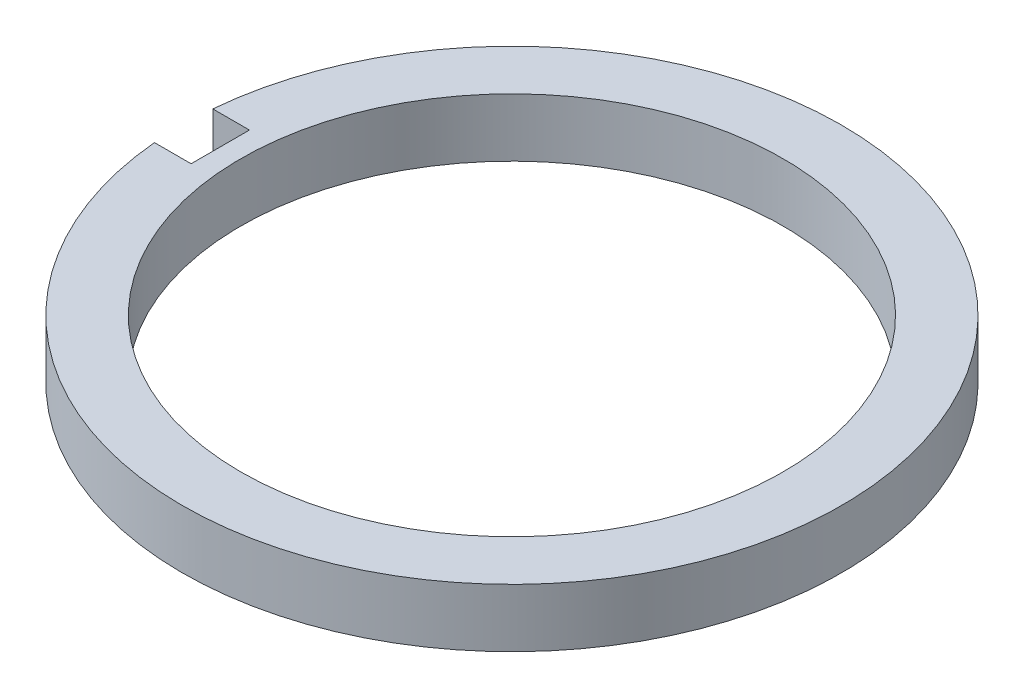
ISO-10303-21;
HEADER;
FILE_DESCRIPTION(('STEP AP214'),'2;1');
FILE_NAME('part.step','',(''),(''),'','','');
FILE_SCHEMA(('AUTOMOTIVE_DESIGN { 1 0 10303 214 1 1 1 1 }'));
ENDSEC;
DATA;
#1=APPLICATION_CONTEXT('core data for automotive mechanical design processes');
#2=APPLICATION_PROTOCOL_DEFINITION('international standard','automotive_design',2000,#1);
#3=PRODUCT_CONTEXT('',#1,'mechanical');
#4=PRODUCT('Part','Part','',(#3));
#5=PRODUCT_RELATED_PRODUCT_CATEGORY('part','',(#4));
#6=PRODUCT_DEFINITION_FORMATION('','',#4);
#7=PRODUCT_DEFINITION_CONTEXT('part definition',#1,'design');
#8=PRODUCT_DEFINITION('design','',#6,#7);
#9=PRODUCT_DEFINITION_SHAPE('','',#8);
#10=(LENGTH_UNIT() NAMED_UNIT(*) SI_UNIT(.MILLI.,.METRE.));
#11=(NAMED_UNIT(*) PLANE_ANGLE_UNIT() SI_UNIT($,.RADIAN.));
#12=(NAMED_UNIT(*) SI_UNIT($,.STERADIAN.) SOLID_ANGLE_UNIT());
#13=UNCERTAINTY_MEASURE_WITH_UNIT(LENGTH_MEASURE(1.E-05),#10,'distance_accuracy_value','');
#14=(GEOMETRIC_REPRESENTATION_CONTEXT(3) GLOBAL_UNCERTAINTY_ASSIGNED_CONTEXT((#13)) GLOBAL_UNIT_ASSIGNED_CONTEXT((#10,
#11,#12)) REPRESENTATION_CONTEXT('',''));
#15=CARTESIAN_POINT('',(0.,0.,0.));
#16=DIRECTION('',(0.,0.,1.));
#17=DIRECTION('',(1.,0.,0.));
#18=AXIS2_PLACEMENT_3D('',#15,#16,#17);
#19=CARTESIAN_POINT('',(0.,12.7,0.));
#20=DIRECTION('',(0.,1.,0.));
#21=DIRECTION('',(0.,0.,1.));
#22=AXIS2_PLACEMENT_3D('',#19,#20,#21);
#23=PLANE('',#22);
#24=DIRECTION('',(-1.,0.,0.));
#25=VECTOR('',#24,1.);
#26=CARTESIAN_POINT('',(-88.9,12.7,-6.34999999999999));
#27=LINE('',#26,#25);
#28=CARTESIAN_POINT('',(-63.5,12.7,-6.34999999999999));
#29=VERTEX_POINT('',#28);
#30=CARTESIAN_POINT('',(-71.4734742754261,12.7,-6.34999999999999));
#31=VERTEX_POINT('',#30);
#32=EDGE_CURVE('E91',#29,#31,#27,.T.);
#33=ORIENTED_EDGE('',*,*,#32,.F.);
#34=DIRECTION('',(0.,0.,-1.));
#35=VECTOR('',#34,1.);
#36=CARTESIAN_POINT('',(-63.5,12.7,-6.34999999999999));
#37=LINE('',#36,#35);
#38=CARTESIAN_POINT('',(-63.5,12.7,6.35000000000001));
#39=VERTEX_POINT('',#38);
#40=EDGE_CURVE('E93',#39,#29,#37,.T.);
#41=ORIENTED_EDGE('',*,*,#40,.F.);
#42=DIRECTION('',(1.,0.,0.));
#43=VECTOR('',#42,1.);
#44=CARTESIAN_POINT('',(-88.9,12.7,6.35000000000001));
#45=LINE('',#44,#43);
#46=CARTESIAN_POINT('',(-71.4734742754261,12.7,6.35000000000001));
#47=VERTEX_POINT('',#46);
#48=EDGE_CURVE('E74',#47,#39,#45,.T.);
#49=ORIENTED_EDGE('',*,*,#48,.F.);
#50=CARTESIAN_POINT('',(0.,12.7,0.));
#51=DIRECTION('',(0.,1.,0.));
#52=DIRECTION('',(0.,0.,1.));
#53=AXIS2_PLACEMENT_3D('',#50,#51,#52);
#54=CIRCLE('',#53,71.755);
#55=EDGE_CURVE('E106',#47,#31,#54,.T.);
#56=ORIENTED_EDGE('',*,*,#55,.T.);
#57=EDGE_LOOP('',(#33,#41,#49,#56));
#58=FACE_BOUND('',#57,.T.);
#59=CARTESIAN_POINT('',(0.,12.7,0.));
#60=DIRECTION('',(0.,1.,0.));
#61=DIRECTION('',(0.,0.,1.));
#62=AXIS2_PLACEMENT_3D('',#59,#60,#61);
#63=CIRCLE('',#62,59.055);
#64=CARTESIAN_POINT('',(0.,12.7,59.055));
#65=VERTEX_POINT('',#64);
#66=EDGE_CURVE('E101',#65,#65,#63,.T.);
#67=ORIENTED_EDGE('',*,*,#66,.F.);
#68=EDGE_LOOP('',(#67));
#69=FACE_BOUND('',#68,.T.);
#70=ADVANCED_FACE('F32',(#58,#69),#23,.T.);
#71=CARTESIAN_POINT('',(0.,0.,0.));
#72=DIRECTION('',(0.,1.,0.));
#73=DIRECTION('',(0.,0.,1.));
#74=AXIS2_PLACEMENT_3D('',#71,#72,#73);
#75=PLANE('',#74);
#76=DIRECTION('',(0.,0.,-1.));
#77=VECTOR('',#76,1.);
#78=CARTESIAN_POINT('',(-63.5,0.,-6.34999999999999));
#79=LINE('',#78,#77);
#80=CARTESIAN_POINT('',(-63.5,0.,6.35000000000001));
#81=VERTEX_POINT('',#80);
#82=CARTESIAN_POINT('',(-63.5,0.,-6.34999999999999));
#83=VERTEX_POINT('',#82);
#84=EDGE_CURVE('E82',#81,#83,#79,.T.);
#85=ORIENTED_EDGE('',*,*,#84,.T.);
#86=DIRECTION('',(-1.,0.,0.));
#87=VECTOR('',#86,1.);
#88=CARTESIAN_POINT('',(-88.9,0.,-6.34999999999999));
#89=LINE('',#88,#87);
#90=CARTESIAN_POINT('',(-71.4734742754261,0.,-6.34999999999999));
#91=VERTEX_POINT('',#90);
#92=EDGE_CURVE('E79',#83,#91,#89,.T.);
#93=ORIENTED_EDGE('',*,*,#92,.T.);
#94=CARTESIAN_POINT('',(0.,0.,0.));
#95=DIRECTION('',(0.,1.,0.));
#96=DIRECTION('',(0.,0.,1.));
#97=AXIS2_PLACEMENT_3D('',#94,#95,#96);
#98=CIRCLE('',#97,71.755);
#99=CARTESIAN_POINT('',(-71.4734742754261,0.,6.35000000000001));
#100=VERTEX_POINT('',#99);
#101=EDGE_CURVE('E90',#100,#91,#98,.T.);
#102=ORIENTED_EDGE('',*,*,#101,.F.);
#103=DIRECTION('',(1.,0.,0.));
#104=VECTOR('',#103,1.);
#105=CARTESIAN_POINT('',(-88.9,0.,6.35000000000001));
#106=LINE('',#105,#104);
#107=EDGE_CURVE('E47',#100,#81,#106,.T.);
#108=ORIENTED_EDGE('',*,*,#107,.T.);
#109=EDGE_LOOP('',(#85,#93,#102,#108));
#110=FACE_BOUND('',#109,.T.);
#111=CARTESIAN_POINT('',(0.,0.,0.));
#112=DIRECTION('',(0.,1.,0.));
#113=DIRECTION('',(0.,0.,1.));
#114=AXIS2_PLACEMENT_3D('',#111,#112,#113);
#115=CIRCLE('',#114,59.055);
#116=CARTESIAN_POINT('',(0.,0.,59.055));
#117=VERTEX_POINT('',#116);
#118=EDGE_CURVE('E99',#117,#117,#115,.T.);
#119=ORIENTED_EDGE('',*,*,#118,.T.);
#120=EDGE_LOOP('',(#119));
#121=FACE_BOUND('',#120,.T.);
#122=ADVANCED_FACE('F87',(#110,#121),#75,.F.);
#123=CARTESIAN_POINT('',(0.,12.7,0.));
#124=DIRECTION('',(0.,-1.,0.));
#125=DIRECTION('',(0.,0.,-1.));
#126=AXIS2_PLACEMENT_3D('',#123,#124,#125);
#127=CYLINDRICAL_SURFACE('',#126,71.755);
#128=ORIENTED_EDGE('',*,*,#101,.T.);
#129=DIRECTION('',(0.,-1.,0.));
#130=VECTOR('',#129,1.);
#131=CARTESIAN_POINT('',(-71.4734742754261,12.7,-6.34999999999999));
#132=LINE('',#131,#130);
#133=EDGE_CURVE('E11',#91,#31,#132,.F.);
#134=ORIENTED_EDGE('',*,*,#133,.T.);
#135=ORIENTED_EDGE('',*,*,#55,.F.);
#136=DIRECTION('',(0.,-1.,0.));
#137=VECTOR('',#136,1.);
#138=CARTESIAN_POINT('',(-71.4734742754261,12.7,6.35000000000001));
#139=LINE('',#138,#137);
#140=EDGE_CURVE('E40',#47,#100,#139,.T.);
#141=ORIENTED_EDGE('',*,*,#140,.T.);
#142=EDGE_LOOP('',(#128,#134,#135,#141));
#143=FACE_BOUND('',#142,.T.);
#144=ADVANCED_FACE('F34',(#143),#127,.T.);
#145=CARTESIAN_POINT('',(0.,12.7,0.));
#146=DIRECTION('',(0.,-1.,0.));
#147=DIRECTION('',(0.,0.,-1.));
#148=AXIS2_PLACEMENT_3D('',#145,#146,#147);
#149=CYLINDRICAL_SURFACE('',#148,59.055);
#150=ORIENTED_EDGE('',*,*,#66,.T.);
#151=EDGE_LOOP('',(#150));
#152=FACE_BOUND('',#151,.T.);
#153=ORIENTED_EDGE('',*,*,#118,.F.);
#154=EDGE_LOOP('',(#153));
#155=FACE_BOUND('',#154,.T.);
#156=ADVANCED_FACE('F116',(#152,#155),#149,.F.);
#157=CARTESIAN_POINT('',(-88.9,0.,-6.34999999999999));
#158=DIRECTION('',(0.,0.,-1.));
#159=DIRECTION('',(-1.,0.,0.));
#160=AXIS2_PLACEMENT_3D('',#157,#158,#159);
#161=PLANE('',#160);
#162=ORIENTED_EDGE('',*,*,#92,.F.);
#163=DIRECTION('',(0.,1.,0.));
#164=VECTOR('',#163,1.);
#165=CARTESIAN_POINT('',(-63.5,0.,-6.34999999999999));
#166=LINE('',#165,#164);
#167=EDGE_CURVE('E78',#83,#29,#166,.T.);
#168=ORIENTED_EDGE('',*,*,#167,.T.);
#169=ORIENTED_EDGE('',*,*,#32,.T.);
#170=ORIENTED_EDGE('',*,*,#133,.F.);
#171=EDGE_LOOP('',(#162,#168,#169,#170));
#172=FACE_BOUND('',#171,.T.);
#173=ADVANCED_FACE('F114',(#172),#161,.F.);
#174=CARTESIAN_POINT('',(-88.9,0.,6.35000000000001));
#175=DIRECTION('',(0.,0.,1.));
#176=DIRECTION('',(1.,0.,0.));
#177=AXIS2_PLACEMENT_3D('',#174,#175,#176);
#178=PLANE('',#177);
#179=ORIENTED_EDGE('',*,*,#48,.T.);
#180=DIRECTION('',(0.,1.,0.));
#181=VECTOR('',#180,1.);
#182=CARTESIAN_POINT('',(-63.5,0.,6.35000000000001));
#183=LINE('',#182,#181);
#184=EDGE_CURVE('E70',#81,#39,#183,.T.);
#185=ORIENTED_EDGE('',*,*,#184,.F.);
#186=ORIENTED_EDGE('',*,*,#107,.F.);
#187=ORIENTED_EDGE('',*,*,#140,.F.);
#188=EDGE_LOOP('',(#179,#185,#186,#187));
#189=FACE_BOUND('',#188,.T.);
#190=ADVANCED_FACE('F72',(#189),#178,.F.);
#191=CARTESIAN_POINT('',(-63.5,0.,-6.34999999999999));
#192=DIRECTION('',(1.,0.,0.));
#193=DIRECTION('',(0.,0.,-1.));
#194=AXIS2_PLACEMENT_3D('',#191,#192,#193);
#195=PLANE('',#194);
#196=ORIENTED_EDGE('',*,*,#40,.T.);
#197=ORIENTED_EDGE('',*,*,#167,.F.);
#198=ORIENTED_EDGE('',*,*,#84,.F.);
#199=ORIENTED_EDGE('',*,*,#184,.T.);
#200=EDGE_LOOP('',(#196,#197,#198,#199));
#201=FACE_BOUND('',#200,.T.);
#202=ADVANCED_FACE('F83',(#201),#195,.F.);
#203=CLOSED_SHELL('',(#70,#122,#144,#156,#173,#190,#202));
#204=MANIFOLD_SOLID_BREP('B2',#203);
#205=ADVANCED_BREP_SHAPE_REPRESENTATION('',(#18,#204),#14);
#206=SHAPE_DEFINITION_REPRESENTATION(#9,#205);
ENDSEC;
END-ISO-10303-21;
